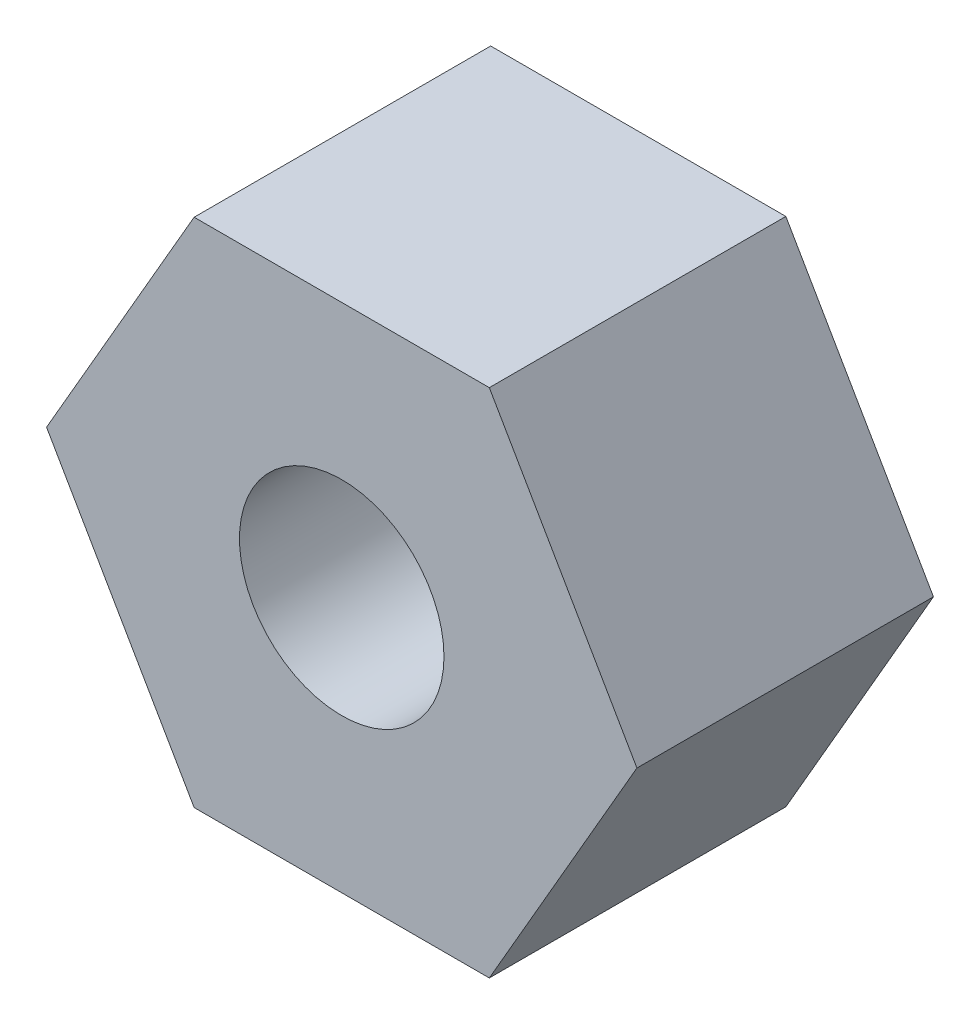
ISO-10303-21;
HEADER;
FILE_DESCRIPTION(('STEP AP214'),'2;1');
FILE_NAME('part.step','',(''),(''),'','','');
FILE_SCHEMA(('AUTOMOTIVE_DESIGN { 1 0 10303 214 1 1 1 1 }'));
ENDSEC;
DATA;
#1=APPLICATION_CONTEXT('core data for automotive mechanical design processes');
#2=APPLICATION_PROTOCOL_DEFINITION('international standard','automotive_design',2000,#1);
#3=PRODUCT_CONTEXT('',#1,'mechanical');
#4=PRODUCT('Part','Part','',(#3));
#5=PRODUCT_RELATED_PRODUCT_CATEGORY('part','',(#4));
#6=PRODUCT_DEFINITION_FORMATION('','',#4);
#7=PRODUCT_DEFINITION_CONTEXT('part definition',#1,'design');
#8=PRODUCT_DEFINITION('design','',#6,#7);
#9=PRODUCT_DEFINITION_SHAPE('','',#8);
#10=(LENGTH_UNIT() NAMED_UNIT(*) SI_UNIT(.MILLI.,.METRE.));
#11=(NAMED_UNIT(*) PLANE_ANGLE_UNIT() SI_UNIT($,.RADIAN.));
#12=(NAMED_UNIT(*) SI_UNIT($,.STERADIAN.) SOLID_ANGLE_UNIT());
#13=UNCERTAINTY_MEASURE_WITH_UNIT(LENGTH_MEASURE(1.E-05),#10,'distance_accuracy_value','');
#14=(GEOMETRIC_REPRESENTATION_CONTEXT(3) GLOBAL_UNCERTAINTY_ASSIGNED_CONTEXT((#13)) GLOBAL_UNIT_ASSIGNED_CONTEXT((#10,
#11,#12)) REPRESENTATION_CONTEXT('',''));
#15=CARTESIAN_POINT('',(0.,0.,0.));
#16=DIRECTION('',(0.,0.,1.));
#17=DIRECTION('',(1.,0.,0.));
#18=AXIS2_PLACEMENT_3D('',#15,#16,#17);
#19=CARTESIAN_POINT('',(0.,0.,5.8));
#20=DIRECTION('',(0.,0.,1.));
#21=DIRECTION('',(1.,0.,0.));
#22=AXIS2_PLACEMENT_3D('',#19,#20,#21);
#23=PLANE('',#22);
#24=DIRECTION('',(1.,0.,0.));
#25=VECTOR('',#24,1.);
#26=CARTESIAN_POINT('',(-2.88675134594813,-5.,5.8));
#27=LINE('',#26,#25);
#28=CARTESIAN_POINT('',(-2.88675134594813,-5.,5.8));
#29=VERTEX_POINT('',#28);
#30=CARTESIAN_POINT('',(2.88675134594813,-5.,5.8));
#31=VERTEX_POINT('',#30);
#32=EDGE_CURVE('E131',#29,#31,#27,.T.);
#33=ORIENTED_EDGE('',*,*,#32,.T.);
#34=DIRECTION('',(0.5,0.866025403784439,0.));
#35=VECTOR('',#34,1.);
#36=CARTESIAN_POINT('',(2.88675134594813,-5.,5.8));
#37=LINE('',#36,#35);
#38=CARTESIAN_POINT('',(5.77350269189626,0.,5.8));
#39=VERTEX_POINT('',#38);
#40=EDGE_CURVE('E89',#31,#39,#37,.T.);
#41=ORIENTED_EDGE('',*,*,#40,.T.);
#42=DIRECTION('',(-0.5,0.866025403784439,0.));
#43=VECTOR('',#42,1.);
#44=CARTESIAN_POINT('',(5.77350269189626,0.,5.8));
#45=LINE('',#44,#43);
#46=CARTESIAN_POINT('',(2.88675134594813,5.,5.8));
#47=VERTEX_POINT('',#46);
#48=EDGE_CURVE('E102',#39,#47,#45,.T.);
#49=ORIENTED_EDGE('',*,*,#48,.T.);
#50=DIRECTION('',(-1.,0.,0.));
#51=VECTOR('',#50,1.);
#52=CARTESIAN_POINT('',(2.88675134594813,5.,5.8));
#53=LINE('',#52,#51);
#54=CARTESIAN_POINT('',(-2.88675134594813,5.,5.8));
#55=VERTEX_POINT('',#54);
#56=EDGE_CURVE('E96',#47,#55,#53,.T.);
#57=ORIENTED_EDGE('',*,*,#56,.T.);
#58=DIRECTION('',(-0.5,-0.866025403784439,0.));
#59=VECTOR('',#58,1.);
#60=CARTESIAN_POINT('',(-2.88675134594813,5.,5.8));
#61=LINE('',#60,#59);
#62=CARTESIAN_POINT('',(-5.77350269189626,0.,5.8));
#63=VERTEX_POINT('',#62);
#64=EDGE_CURVE('E100',#55,#63,#61,.T.);
#65=ORIENTED_EDGE('',*,*,#64,.T.);
#66=DIRECTION('',(0.5,-0.866025403784439,0.));
#67=VECTOR('',#66,1.);
#68=CARTESIAN_POINT('',(-5.77350269189626,0.,5.8));
#69=LINE('',#68,#67);
#70=EDGE_CURVE('E52',#63,#29,#69,.T.);
#71=ORIENTED_EDGE('',*,*,#70,.T.);
#72=EDGE_LOOP('',(#33,#41,#49,#57,#65,#71));
#73=FACE_BOUND('',#72,.T.);
#74=CARTESIAN_POINT('',(0.,0.,5.8));
#75=DIRECTION('',(0.,0.,1.));
#76=DIRECTION('',(1.,0.,0.));
#77=AXIS2_PLACEMENT_3D('',#74,#75,#76);
#78=CIRCLE('',#77,2.);
#79=CARTESIAN_POINT('',(2.,0.,5.8));
#80=VERTEX_POINT('',#79);
#81=EDGE_CURVE('E124',#80,#80,#78,.T.);
#82=ORIENTED_EDGE('',*,*,#81,.F.);
#83=EDGE_LOOP('',(#82));
#84=FACE_BOUND('',#83,.T.);
#85=ADVANCED_FACE('F35',(#73,#84),#23,.T.);
#86=CARTESIAN_POINT('',(0.,0.,0.));
#87=DIRECTION('',(0.,0.,1.));
#88=DIRECTION('',(1.,0.,0.));
#89=AXIS2_PLACEMENT_3D('',#86,#87,#88);
#90=PLANE('',#89);
#91=DIRECTION('',(1.,0.,0.));
#92=VECTOR('',#91,1.);
#93=CARTESIAN_POINT('',(-2.88675134594813,-5.,0.));
#94=LINE('',#93,#92);
#95=CARTESIAN_POINT('',(-2.88675134594813,-5.,0.));
#96=VERTEX_POINT('',#95);
#97=CARTESIAN_POINT('',(2.88675134594813,-5.,0.));
#98=VERTEX_POINT('',#97);
#99=EDGE_CURVE('E120',#96,#98,#94,.T.);
#100=ORIENTED_EDGE('',*,*,#99,.F.);
#101=DIRECTION('',(0.5,-0.866025403784439,0.));
#102=VECTOR('',#101,1.);
#103=CARTESIAN_POINT('',(-5.77350269189626,0.,0.));
#104=LINE('',#103,#102);
#105=CARTESIAN_POINT('',(-5.77350269189626,0.,0.));
#106=VERTEX_POINT('',#105);
#107=EDGE_CURVE('E81',#106,#96,#104,.T.);
#108=ORIENTED_EDGE('',*,*,#107,.F.);
#109=DIRECTION('',(-0.5,-0.866025403784439,0.));
#110=VECTOR('',#109,1.);
#111=CARTESIAN_POINT('',(-2.88675134594813,5.,0.));
#112=LINE('',#111,#110);
#113=CARTESIAN_POINT('',(-2.88675134594813,5.,0.));
#114=VERTEX_POINT('',#113);
#115=EDGE_CURVE('E75',#114,#106,#112,.T.);
#116=ORIENTED_EDGE('',*,*,#115,.F.);
#117=DIRECTION('',(-1.,0.,0.));
#118=VECTOR('',#117,1.);
#119=CARTESIAN_POINT('',(2.88675134594813,5.,0.));
#120=LINE('',#119,#118);
#121=CARTESIAN_POINT('',(2.88675134594813,5.,0.));
#122=VERTEX_POINT('',#121);
#123=EDGE_CURVE('E110',#122,#114,#120,.T.);
#124=ORIENTED_EDGE('',*,*,#123,.F.);
#125=DIRECTION('',(-0.5,0.866025403784439,0.));
#126=VECTOR('',#125,1.);
#127=CARTESIAN_POINT('',(5.77350269189626,0.,0.));
#128=LINE('',#127,#126);
#129=CARTESIAN_POINT('',(5.77350269189626,0.,0.));
#130=VERTEX_POINT('',#129);
#131=EDGE_CURVE('E126',#130,#122,#128,.T.);
#132=ORIENTED_EDGE('',*,*,#131,.F.);
#133=DIRECTION('',(0.5,0.866025403784439,0.));
#134=VECTOR('',#133,1.);
#135=CARTESIAN_POINT('',(2.88675134594813,-5.,0.));
#136=LINE('',#135,#134);
#137=EDGE_CURVE('E123',#98,#130,#136,.T.);
#138=ORIENTED_EDGE('',*,*,#137,.F.);
#139=EDGE_LOOP('',(#100,#108,#116,#124,#132,#138));
#140=FACE_BOUND('',#139,.T.);
#141=CARTESIAN_POINT('',(0.,0.,0.));
#142=DIRECTION('',(0.,0.,1.));
#143=DIRECTION('',(1.,0.,0.));
#144=AXIS2_PLACEMENT_3D('',#141,#142,#143);
#145=CIRCLE('',#144,2.);
#146=CARTESIAN_POINT('',(2.,0.,0.));
#147=VERTEX_POINT('',#146);
#148=EDGE_CURVE('E224',#147,#147,#145,.T.);
#149=ORIENTED_EDGE('',*,*,#148,.T.);
#150=EDGE_LOOP('',(#149));
#151=FACE_BOUND('',#150,.T.);
#152=ADVANCED_FACE('F140',(#140,#151),#90,.F.);
#153=CARTESIAN_POINT('',(-2.88675134594813,-5.,5.8));
#154=DIRECTION('',(0.,1.,0.));
#155=DIRECTION('',(-1.,0.,0.));
#156=AXIS2_PLACEMENT_3D('',#153,#154,#155);
#157=PLANE('',#156);
#158=ORIENTED_EDGE('',*,*,#99,.T.);
#159=DIRECTION('',(0.,0.,-1.));
#160=VECTOR('',#159,1.);
#161=CARTESIAN_POINT('',(2.88675134594813,-5.,5.8));
#162=LINE('',#161,#160);
#163=EDGE_CURVE('E11',#31,#98,#162,.T.);
#164=ORIENTED_EDGE('',*,*,#163,.F.);
#165=ORIENTED_EDGE('',*,*,#32,.F.);
#166=DIRECTION('',(0.,0.,-1.));
#167=VECTOR('',#166,1.);
#168=CARTESIAN_POINT('',(-2.88675134594813,-5.,5.8));
#169=LINE('',#168,#167);
#170=EDGE_CURVE('E116',#29,#96,#169,.T.);
#171=ORIENTED_EDGE('',*,*,#170,.T.);
#172=EDGE_LOOP('',(#158,#164,#165,#171));
#173=FACE_BOUND('',#172,.T.);
#174=ADVANCED_FACE('F37',(#173),#157,.F.);
#175=CARTESIAN_POINT('',(2.88675134594813,-5.,5.8));
#176=DIRECTION('',(-0.866025403784439,0.5,0.));
#177=DIRECTION('',(-0.5,-0.866025403784439,0.));
#178=AXIS2_PLACEMENT_3D('',#175,#176,#177);
#179=PLANE('',#178);
#180=ORIENTED_EDGE('',*,*,#137,.T.);
#181=DIRECTION('',(0.,0.,-1.));
#182=VECTOR('',#181,1.);
#183=CARTESIAN_POINT('',(5.77350269189626,0.,5.8));
#184=LINE('',#183,#182);
#185=EDGE_CURVE('E44',#39,#130,#184,.T.);
#186=ORIENTED_EDGE('',*,*,#185,.F.);
#187=ORIENTED_EDGE('',*,*,#40,.F.);
#188=ORIENTED_EDGE('',*,*,#163,.T.);
#189=EDGE_LOOP('',(#180,#186,#187,#188));
#190=FACE_BOUND('',#189,.T.);
#191=ADVANCED_FACE('F165',(#190),#179,.F.);
#192=CARTESIAN_POINT('',(5.77350269189626,0.,5.8));
#193=DIRECTION('',(-0.866025403784439,-0.5,0.));
#194=DIRECTION('',(0.5,-0.866025403784439,0.));
#195=AXIS2_PLACEMENT_3D('',#192,#193,#194);
#196=PLANE('',#195);
#197=ORIENTED_EDGE('',*,*,#131,.T.);
#198=DIRECTION('',(0.,0.,-1.));
#199=VECTOR('',#198,1.);
#200=CARTESIAN_POINT('',(2.88675134594813,5.,5.8));
#201=LINE('',#200,#199);
#202=EDGE_CURVE('E111',#47,#122,#201,.T.);
#203=ORIENTED_EDGE('',*,*,#202,.F.);
#204=ORIENTED_EDGE('',*,*,#48,.F.);
#205=ORIENTED_EDGE('',*,*,#185,.T.);
#206=EDGE_LOOP('',(#197,#203,#204,#205));
#207=FACE_BOUND('',#206,.T.);
#208=ADVANCED_FACE('F137',(#207),#196,.F.);
#209=CARTESIAN_POINT('',(2.88675134594813,5.,5.8));
#210=DIRECTION('',(0.,-1.,0.));
#211=DIRECTION('',(1.,0.,0.));
#212=AXIS2_PLACEMENT_3D('',#209,#210,#211);
#213=PLANE('',#212);
#214=ORIENTED_EDGE('',*,*,#123,.T.);
#215=DIRECTION('',(0.,0.,-1.));
#216=VECTOR('',#215,1.);
#217=CARTESIAN_POINT('',(-2.88675134594813,5.,5.8));
#218=LINE('',#217,#216);
#219=EDGE_CURVE('E107',#55,#114,#218,.T.);
#220=ORIENTED_EDGE('',*,*,#219,.F.);
#221=ORIENTED_EDGE('',*,*,#56,.F.);
#222=ORIENTED_EDGE('',*,*,#202,.T.);
#223=EDGE_LOOP('',(#214,#220,#221,#222));
#224=FACE_BOUND('',#223,.T.);
#225=ADVANCED_FACE('F108',(#224),#213,.F.);
#226=CARTESIAN_POINT('',(-2.88675134594813,5.,5.8));
#227=DIRECTION('',(0.866025403784439,-0.5,0.));
#228=DIRECTION('',(0.5,0.866025403784439,0.));
#229=AXIS2_PLACEMENT_3D('',#226,#227,#228);
#230=PLANE('',#229);
#231=ORIENTED_EDGE('',*,*,#115,.T.);
#232=DIRECTION('',(0.,0.,-1.));
#233=VECTOR('',#232,1.);
#234=CARTESIAN_POINT('',(-5.77350269189626,0.,5.8));
#235=LINE('',#234,#233);
#236=EDGE_CURVE('E112',#63,#106,#235,.T.);
#237=ORIENTED_EDGE('',*,*,#236,.F.);
#238=ORIENTED_EDGE('',*,*,#64,.F.);
#239=ORIENTED_EDGE('',*,*,#219,.T.);
#240=EDGE_LOOP('',(#231,#237,#238,#239));
#241=FACE_BOUND('',#240,.T.);
#242=ADVANCED_FACE('F114',(#241),#230,.F.);
#243=CARTESIAN_POINT('',(-5.77350269189626,0.,5.8));
#244=DIRECTION('',(0.866025403784439,0.5,0.));
#245=DIRECTION('',(-0.5,0.866025403784439,0.));
#246=AXIS2_PLACEMENT_3D('',#243,#244,#245);
#247=PLANE('',#246);
#248=ORIENTED_EDGE('',*,*,#107,.T.);
#249=ORIENTED_EDGE('',*,*,#170,.F.);
#250=ORIENTED_EDGE('',*,*,#70,.F.);
#251=ORIENTED_EDGE('',*,*,#236,.T.);
#252=EDGE_LOOP('',(#248,#249,#250,#251));
#253=FACE_BOUND('',#252,.T.);
#254=ADVANCED_FACE('F145',(#253),#247,.F.);
#255=CARTESIAN_POINT('',(0.,0.,5.8));
#256=DIRECTION('',(0.,0.,-1.));
#257=DIRECTION('',(-1.,0.,0.));
#258=AXIS2_PLACEMENT_3D('',#255,#256,#257);
#259=CYLINDRICAL_SURFACE('',#258,2.);
#260=ORIENTED_EDGE('',*,*,#81,.T.);
#261=EDGE_LOOP('',(#260));
#262=FACE_BOUND('',#261,.T.);
#263=ORIENTED_EDGE('',*,*,#148,.F.);
#264=EDGE_LOOP('',(#263));
#265=FACE_BOUND('',#264,.T.);
#266=ADVANCED_FACE('F147',(#262,#265),#259,.F.);
#267=CLOSED_SHELL('',(#85,#152,#174,#191,#208,#225,#242,#254,#266));
#268=MANIFOLD_SOLID_BREP('B2',#267);
#269=ADVANCED_BREP_SHAPE_REPRESENTATION('',(#18,#268),#14);
#270=SHAPE_DEFINITION_REPRESENTATION(#9,#269);
ENDSEC;
END-ISO-10303-21;
